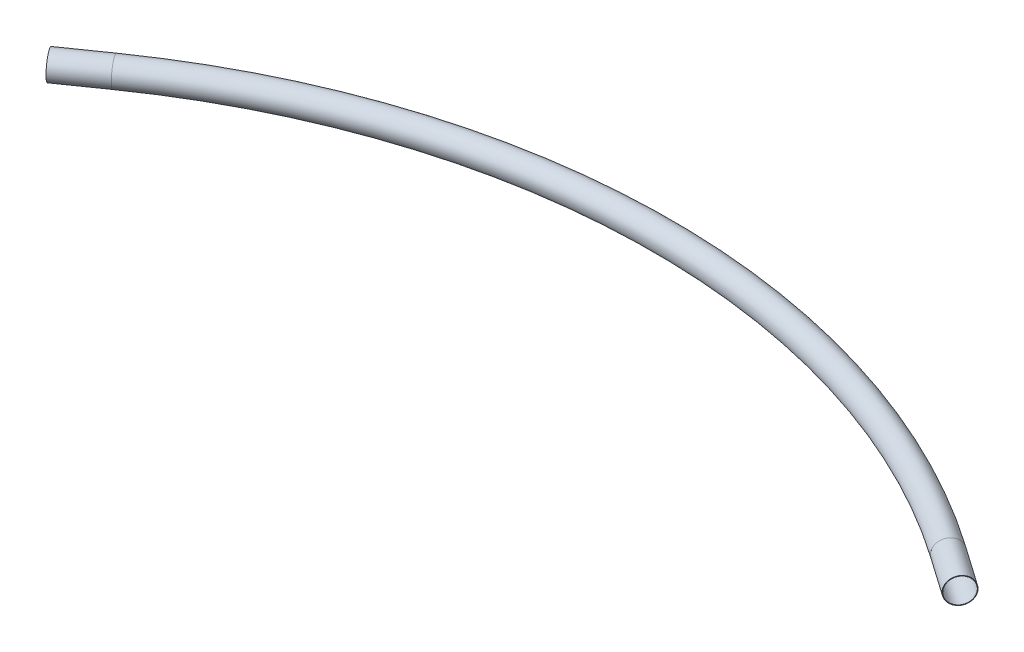
ISO-10303-21;
HEADER;
FILE_DESCRIPTION(('STEP AP214'),'2;1');
FILE_NAME('part.step','',(''),(''),'','','');
FILE_SCHEMA(('AUTOMOTIVE_DESIGN { 1 0 10303 214 1 1 1 1 }'));
ENDSEC;
DATA;
#1=APPLICATION_CONTEXT('core data for automotive mechanical design processes');
#2=APPLICATION_PROTOCOL_DEFINITION('international standard','automotive_design',2000,#1);
#3=PRODUCT_CONTEXT('',#1,'mechanical');
#4=PRODUCT('Part','Part','',(#3));
#5=PRODUCT_RELATED_PRODUCT_CATEGORY('part','',(#4));
#6=PRODUCT_DEFINITION_FORMATION('','',#4);
#7=PRODUCT_DEFINITION_CONTEXT('part definition',#1,'design');
#8=PRODUCT_DEFINITION('design','',#6,#7);
#9=PRODUCT_DEFINITION_SHAPE('','',#8);
#10=(LENGTH_UNIT() NAMED_UNIT(*) SI_UNIT(.MILLI.,.METRE.));
#11=(NAMED_UNIT(*) PLANE_ANGLE_UNIT() SI_UNIT($,.RADIAN.));
#12=(NAMED_UNIT(*) SI_UNIT($,.STERADIAN.) SOLID_ANGLE_UNIT());
#13=UNCERTAINTY_MEASURE_WITH_UNIT(LENGTH_MEASURE(1.E-05),#10,'distance_accuracy_value','');
#14=(GEOMETRIC_REPRESENTATION_CONTEXT(3) GLOBAL_UNCERTAINTY_ASSIGNED_CONTEXT((#13)) GLOBAL_UNIT_ASSIGNED_CONTEXT((#10,
#11,#12)) REPRESENTATION_CONTEXT('',''));
#15=CARTESIAN_POINT('',(0.,0.,0.));
#16=DIRECTION('',(0.,0.,1.));
#17=DIRECTION('',(1.,0.,0.));
#18=AXIS2_PLACEMENT_3D('',#15,#16,#17);
#19=CARTESIAN_POINT('',(-2961.22626151181,0.,174.685028508988));
#20=DIRECTION('',(0.819475923595164,0.,-0.573113610593793));
#21=DIRECTION('',(-0.573113610593793,0.,-0.819475923595164));
#22=AXIS2_PLACEMENT_3D('',#19,#20,#21);
#23=CYLINDRICAL_SURFACE('',#22,80.7339000000001);
#24=CARTESIAN_POINT('',(-2961.22626151181,0.,174.685028508988));
#25=DIRECTION('',(-0.819475923595164,0.,0.573113610593793));
#26=DIRECTION('',(0.573113610593793,0.,0.819475923595164));
#27=AXIS2_PLACEMENT_3D('',#24,#25,#26);
#28=CIRCLE('',#27,80.7339000000001);
#29=CARTESIAN_POINT('',(-2914.95656458549,0.,240.844515776928));
#30=VERTEX_POINT('',#29);
#31=EDGE_CURVE('E52',#30,#30,#28,.T.);
#32=ORIENTED_EDGE('',*,*,#31,.T.);
#33=EDGE_LOOP('',(#32));
#34=FACE_BOUND('',#33,.T.);
#35=CARTESIAN_POINT('',(-2711.45,0.,0.));
#36=DIRECTION('',(-0.819475923595164,0.,0.573113610593793));
#37=DIRECTION('',(0.573113610593793,0.,0.819475923595164));
#38=AXIS2_PLACEMENT_3D('',#35,#36,#37);
#39=CIRCLE('',#38,80.7339000000001);
#40=CARTESIAN_POINT('',(-2665.18030307368,0.,66.1594872679397));
#41=VERTEX_POINT('',#40);
#42=EDGE_CURVE('E58',#41,#41,#39,.T.);
#43=ORIENTED_EDGE('',*,*,#42,.F.);
#44=EDGE_LOOP('',(#43));
#45=FACE_BOUND('',#44,.T.);
#46=ADVANCED_FACE('F45',(#34,#45),#23,.F.);
#47=CARTESIAN_POINT('',(-2961.22626151181,0.,174.685028508988));
#48=DIRECTION('',(0.819475923595164,0.,-0.573113610593793));
#49=DIRECTION('',(-0.573113610593793,0.,-0.819475923595164));
#50=AXIS2_PLACEMENT_3D('',#47,#48,#49);
#51=CYLINDRICAL_SURFACE('',#50,84.1375000000001);
#52=CARTESIAN_POINT('',(-2961.22626151181,0.,174.685028508988));
#53=DIRECTION('',(-0.819475923595164,0.,0.573113610593793));
#54=DIRECTION('',(0.573113610593793,0.,0.819475923595164));
#55=AXIS2_PLACEMENT_3D('',#52,#53,#54);
#56=CIRCLE('',#55,84.1375000000001);
#57=CARTESIAN_POINT('',(-2913.00591510047,0.,243.633684030476));
#58=VERTEX_POINT('',#57);
#59=EDGE_CURVE('E12',#58,#58,#56,.T.);
#60=ORIENTED_EDGE('',*,*,#59,.F.);
#61=EDGE_LOOP('',(#60));
#62=FACE_BOUND('',#61,.T.);
#63=CARTESIAN_POINT('',(-2711.45,0.,0.));
#64=DIRECTION('',(-0.819475923595164,0.,0.573113610593793));
#65=DIRECTION('',(0.573113610593793,0.,0.819475923595164));
#66=AXIS2_PLACEMENT_3D('',#63,#64,#65);
#67=CIRCLE('',#66,84.1375000000001);
#68=CARTESIAN_POINT('',(-2663.22965358867,0.,68.9486555214881));
#69=VERTEX_POINT('',#68);
#70=EDGE_CURVE('E48',#69,#69,#67,.T.);
#71=ORIENTED_EDGE('',*,*,#70,.T.);
#72=EDGE_LOOP('',(#71));
#73=FACE_BOUND('',#72,.T.);
#74=ADVANCED_FACE('F65',(#62,#73),#51,.T.);
#75=CARTESIAN_POINT('',(-2961.22626151181,0.,174.685028508988));
#76=DIRECTION('',(-0.819475923595164,0.,0.573113610593793));
#77=DIRECTION('',(0.573113610593793,0.,0.819475923595164));
#78=AXIS2_PLACEMENT_3D('',#75,#76,#77);
#79=PLANE('',#78);
#80=ORIENTED_EDGE('',*,*,#31,.F.);
#81=EDGE_LOOP('',(#80));
#82=FACE_BOUND('',#81,.T.);
#83=ORIENTED_EDGE('',*,*,#59,.T.);
#84=EDGE_LOOP('',(#83));
#85=FACE_BOUND('',#84,.T.);
#86=ADVANCED_FACE('F69',(#82,#85),#79,.T.);
#87=CARTESIAN_POINT('',(-2711.45,0.,0.));
#88=DIRECTION('',(-0.819475923595164,0.,0.573113610593793));
#89=DIRECTION('',(0.573113610593793,0.,0.819475923595164));
#90=AXIS2_PLACEMENT_3D('',#87,#88,#89);
#91=PLANE('',#90);
#92=ORIENTED_EDGE('',*,*,#42,.T.);
#93=EDGE_LOOP('',(#92));
#94=FACE_BOUND('',#93,.T.);
#95=ORIENTED_EDGE('',*,*,#70,.F.);
#96=EDGE_LOOP('',(#95));
#97=FACE_BOUND('',#96,.T.);
#98=ADVANCED_FACE('F67',(#94,#97),#91,.F.);
#99=CLOSED_SHELL('',(#46,#74,#86,#98));
#100=MANIFOLD_SOLID_BREP('B2',#99);
#101=CARTESIAN_POINT('',(0.,0.,3877.01138475836));
#102=DIRECTION('',(0.,-1.,0.));
#103=DIRECTION('',(0.,0.,-1.));
#104=AXIS2_PLACEMENT_3D('',#101,#102,#103);
#105=TOROIDAL_SURFACE('',#104,4731.08638475836,80.7339000000001);
#106=CARTESIAN_POINT('',(-2711.45,0.,0.));
#107=DIRECTION('',(-0.819475923595164,0.,0.573113610593793));
#108=DIRECTION('',(0.573113610593793,0.,0.819475923595164));
#109=AXIS2_PLACEMENT_3D('',#106,#107,#108);
#110=CIRCLE('',#109,80.7339000000001);
#111=CARTESIAN_POINT('',(-2757.71969692632,0.,-66.1594872679396));
#112=VERTEX_POINT('',#111);
#113=EDGE_CURVE('E129',#112,#112,#110,.T.);
#114=CARTESIAN_POINT('',(2711.45,0.,0.));
#115=DIRECTION('',(-0.819475923595164,0.,-0.573113610593793));
#116=DIRECTION('',(-0.573113610593793,0.,0.819475923595164));
#117=AXIS2_PLACEMENT_3D('',#114,#115,#116);
#118=CIRCLE('',#117,80.7339000000001);
#119=CARTESIAN_POINT('',(2757.71969692632,0.,-66.1594872679396));
#120=VERTEX_POINT('',#119);
#121=EDGE_CURVE('E137',#120,#120,#118,.T.);
#122=CARTESIAN_POINT('',(0.,0.,3877.01138475836));
#123=DIRECTION('',(0.,-1.,0.));
#124=DIRECTION('',(0.,0.,-1.));
#125=AXIS2_PLACEMENT_3D('',#122,#123,#124);
#126=CIRCLE('',#125,4811.82028475836);
#127=EDGE_CURVE('',#112,#120,#126,.T.);
#128=ORIENTED_EDGE('',*,*,#113,.T.);
#129=ORIENTED_EDGE('',*,*,#121,.F.);
#130=ORIENTED_EDGE('',*,*,#127,.T.);
#131=ORIENTED_EDGE('',*,*,#127,.F.);
#132=EDGE_LOOP('',(#128,#130,#129,#131));
#133=FACE_BOUND('',#132,.T.);
#134=ADVANCED_FACE('F122',(#133),#105,.F.);
#135=CARTESIAN_POINT('',(0.,0.,3877.01138475836));
#136=DIRECTION('',(0.,-1.,0.));
#137=DIRECTION('',(0.,0.,-1.));
#138=AXIS2_PLACEMENT_3D('',#135,#136,#137);
#139=TOROIDAL_SURFACE('',#138,4731.08638475836,84.1375000000001);
#140=CARTESIAN_POINT('',(-2711.45,0.,0.));
#141=DIRECTION('',(-0.819475923595164,0.,0.573113610593793));
#142=DIRECTION('',(0.573113610593793,0.,0.819475923595164));
#143=AXIS2_PLACEMENT_3D('',#140,#141,#142);
#144=CIRCLE('',#143,84.1375000000001);
#145=CARTESIAN_POINT('',(-2759.67034641134,0.,-68.948655521488));
#146=VERTEX_POINT('',#145);
#147=EDGE_CURVE('E44',#146,#146,#144,.T.);
#148=CARTESIAN_POINT('',(2711.45,0.,0.));
#149=DIRECTION('',(-0.819475923595164,0.,-0.573113610593793));
#150=DIRECTION('',(-0.573113610593793,0.,0.819475923595164));
#151=AXIS2_PLACEMENT_3D('',#148,#149,#150);
#152=CIRCLE('',#151,84.1375000000001);
#153=CARTESIAN_POINT('',(2759.67034641134,0.,-68.948655521488));
#154=VERTEX_POINT('',#153);
#155=EDGE_CURVE('E133',#154,#154,#152,.T.);
#156=CARTESIAN_POINT('',(0.,0.,3877.01138475836));
#157=DIRECTION('',(0.,-1.,0.));
#158=DIRECTION('',(0.,0.,-1.));
#159=AXIS2_PLACEMENT_3D('',#156,#157,#158);
#160=CIRCLE('',#159,4815.22388475836);
#161=EDGE_CURVE('',#146,#154,#160,.T.);
#162=ORIENTED_EDGE('',*,*,#147,.F.);
#163=ORIENTED_EDGE('',*,*,#155,.T.);
#164=ORIENTED_EDGE('',*,*,#161,.T.);
#165=ORIENTED_EDGE('',*,*,#161,.F.);
#166=EDGE_LOOP('',(#162,#164,#163,#165));
#167=FACE_BOUND('',#166,.T.);
#168=ADVANCED_FACE('F124',(#167),#139,.T.);
#169=CARTESIAN_POINT('',(-2711.45,0.,0.));
#170=DIRECTION('',(-0.819475923595164,0.,0.573113610593793));
#171=DIRECTION('',(0.573113610593793,0.,0.819475923595164));
#172=AXIS2_PLACEMENT_3D('',#169,#170,#171);
#173=PLANE('',#172);
#174=ORIENTED_EDGE('',*,*,#113,.F.);
#175=EDGE_LOOP('',(#174));
#176=FACE_BOUND('',#175,.T.);
#177=ORIENTED_EDGE('',*,*,#147,.T.);
#178=EDGE_LOOP('',(#177));
#179=FACE_BOUND('',#178,.T.);
#180=ADVANCED_FACE('F147',(#176,#179),#173,.T.);
#181=CARTESIAN_POINT('',(2711.45,0.,0.));
#182=DIRECTION('',(-0.819475923595164,0.,-0.573113610593793));
#183=DIRECTION('',(-0.573113610593793,0.,0.819475923595164));
#184=AXIS2_PLACEMENT_3D('',#181,#182,#183);
#185=PLANE('',#184);
#186=ORIENTED_EDGE('',*,*,#121,.T.);
#187=EDGE_LOOP('',(#186));
#188=FACE_BOUND('',#187,.T.);
#189=ORIENTED_EDGE('',*,*,#155,.F.);
#190=EDGE_LOOP('',(#189));
#191=FACE_BOUND('',#190,.T.);
#192=ADVANCED_FACE('F143',(#188,#191),#185,.F.);
#193=CLOSED_SHELL('',(#134,#168,#180,#192));
#194=MANIFOLD_SOLID_BREP('B7',#193);
#195=CARTESIAN_POINT('',(2711.45,0.,0.));
#196=DIRECTION('',(0.819475923595162,0.,0.573113610593795));
#197=DIRECTION('',(0.573113610593795,0.,-0.819475923595162));
#198=AXIS2_PLACEMENT_3D('',#195,#196,#197);
#199=CYLINDRICAL_SURFACE('',#198,80.7339000000001);
#200=CARTESIAN_POINT('',(2711.45,0.,0.));
#201=DIRECTION('',(-0.819475923595164,0.,-0.573113610593793));
#202=DIRECTION('',(-0.573113610593793,0.,0.819475923595164));
#203=AXIS2_PLACEMENT_3D('',#200,#201,#202);
#204=CIRCLE('',#203,80.7339000000001);
#205=CARTESIAN_POINT('',(2665.18030307368,0.,66.1594872679396));
#206=VERTEX_POINT('',#205);
#207=EDGE_CURVE('E199',#206,#206,#204,.T.);
#208=ORIENTED_EDGE('',*,*,#207,.T.);
#209=EDGE_LOOP('',(#208));
#210=FACE_BOUND('',#209,.T.);
#211=CARTESIAN_POINT('',(2961.22626151181,0.,174.685028508988));
#212=DIRECTION('',(-0.819475923595164,0.,-0.573113610593793));
#213=DIRECTION('',(-0.573113610593793,0.,0.819475923595164));
#214=AXIS2_PLACEMENT_3D('',#211,#212,#213);
#215=CIRCLE('',#214,80.7339000000001);
#216=CARTESIAN_POINT('',(2914.95656458549,0.,240.844515776928));
#217=VERTEX_POINT('',#216);
#218=EDGE_CURVE('E205',#217,#217,#215,.T.);
#219=ORIENTED_EDGE('',*,*,#218,.F.);
#220=EDGE_LOOP('',(#219));
#221=FACE_BOUND('',#220,.T.);
#222=ADVANCED_FACE('F192',(#210,#221),#199,.F.);
#223=CARTESIAN_POINT('',(2711.45,0.,0.));
#224=DIRECTION('',(0.819475923595162,0.,0.573113610593795));
#225=DIRECTION('',(0.573113610593795,0.,-0.819475923595162));
#226=AXIS2_PLACEMENT_3D('',#223,#224,#225);
#227=CYLINDRICAL_SURFACE('',#226,84.1375000000001);
#228=CARTESIAN_POINT('',(2711.45,0.,0.));
#229=DIRECTION('',(-0.819475923595164,0.,-0.573113610593793));
#230=DIRECTION('',(-0.573113610593793,0.,0.819475923595164));
#231=AXIS2_PLACEMENT_3D('',#228,#229,#230);
#232=CIRCLE('',#231,84.1375000000001);
#233=CARTESIAN_POINT('',(2663.22965358866,0.,68.9486555214881));
#234=VERTEX_POINT('',#233);
#235=EDGE_CURVE('E121',#234,#234,#232,.T.);
#236=ORIENTED_EDGE('',*,*,#235,.F.);
#237=EDGE_LOOP('',(#236));
#238=FACE_BOUND('',#237,.T.);
#239=CARTESIAN_POINT('',(2961.22626151181,0.,174.685028508988));
#240=DIRECTION('',(-0.819475923595164,0.,-0.573113610593793));
#241=DIRECTION('',(-0.573113610593793,0.,0.819475923595164));
#242=AXIS2_PLACEMENT_3D('',#239,#240,#241);
#243=CIRCLE('',#242,84.1375000000001);
#244=CARTESIAN_POINT('',(2913.00591510047,0.,243.633684030477));
#245=VERTEX_POINT('',#244);
#246=EDGE_CURVE('E195',#245,#245,#243,.T.);
#247=ORIENTED_EDGE('',*,*,#246,.T.);
#248=EDGE_LOOP('',(#247));
#249=FACE_BOUND('',#248,.T.);
#250=ADVANCED_FACE('F212',(#238,#249),#227,.T.);
#251=CARTESIAN_POINT('',(2711.45,0.,0.));
#252=DIRECTION('',(-0.819475923595164,0.,-0.573113610593793));
#253=DIRECTION('',(-0.573113610593793,0.,0.819475923595164));
#254=AXIS2_PLACEMENT_3D('',#251,#252,#253);
#255=PLANE('',#254);
#256=ORIENTED_EDGE('',*,*,#207,.F.);
#257=EDGE_LOOP('',(#256));
#258=FACE_BOUND('',#257,.T.);
#259=ORIENTED_EDGE('',*,*,#235,.T.);
#260=EDGE_LOOP('',(#259));
#261=FACE_BOUND('',#260,.T.);
#262=ADVANCED_FACE('F216',(#258,#261),#255,.T.);
#263=CARTESIAN_POINT('',(2961.22626151181,0.,174.685028508988));
#264=DIRECTION('',(-0.819475923595164,0.,-0.573113610593793));
#265=DIRECTION('',(-0.573113610593793,0.,0.819475923595164));
#266=AXIS2_PLACEMENT_3D('',#263,#264,#265);
#267=PLANE('',#266);
#268=ORIENTED_EDGE('',*,*,#218,.T.);
#269=EDGE_LOOP('',(#268));
#270=FACE_BOUND('',#269,.T.);
#271=ORIENTED_EDGE('',*,*,#246,.F.);
#272=EDGE_LOOP('',(#271));
#273=FACE_BOUND('',#272,.T.);
#274=ADVANCED_FACE('F214',(#270,#273),#267,.F.);
#275=CLOSED_SHELL('',(#222,#250,#262,#274));
#276=MANIFOLD_SOLID_BREP('B39',#275);
#277=ADVANCED_BREP_SHAPE_REPRESENTATION('',(#18,#100,#194,#276),#14);
#278=SHAPE_DEFINITION_REPRESENTATION(#9,#277);
ENDSEC;
END-ISO-10303-21;
